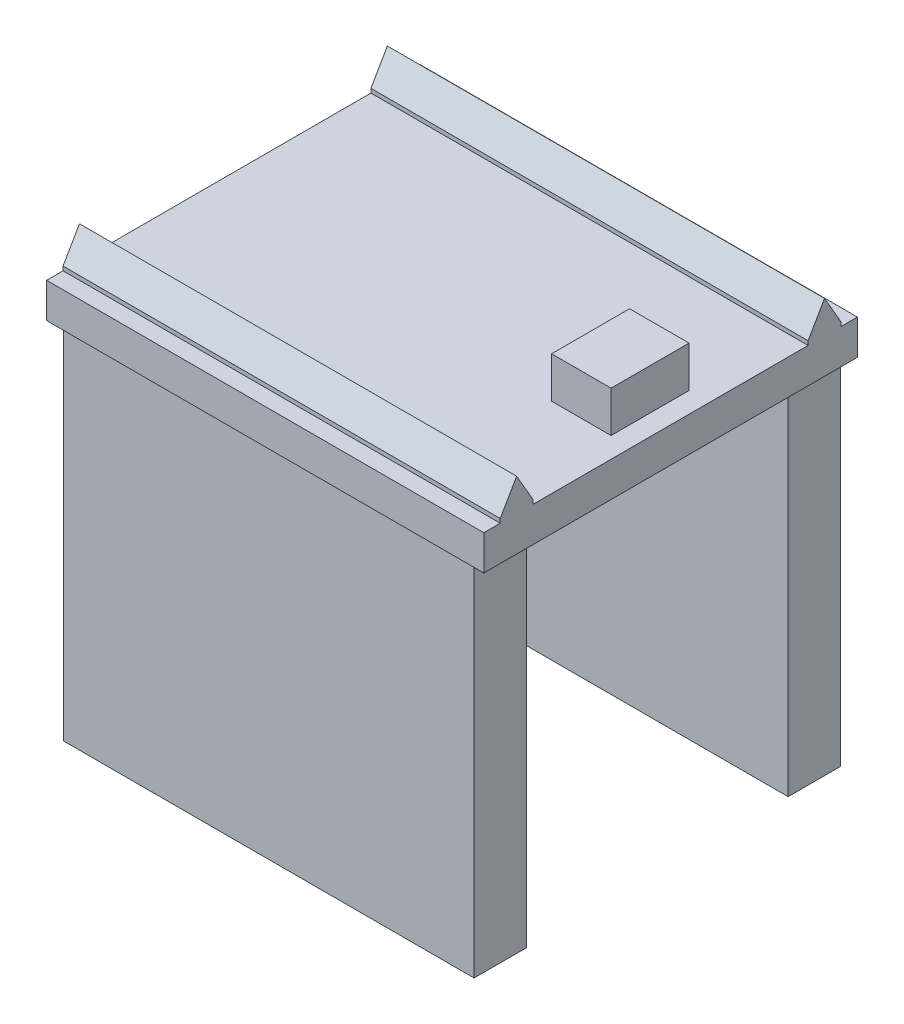
ISO-10303-21;
HEADER;
FILE_DESCRIPTION(('STEP AP214'),'2;1');
FILE_NAME('part.step','',(''),(''),'','','');
FILE_SCHEMA(('AUTOMOTIVE_DESIGN { 1 0 10303 214 1 1 1 1 }'));
ENDSEC;
DATA;
#1=APPLICATION_CONTEXT('core data for automotive mechanical design processes');
#2=APPLICATION_PROTOCOL_DEFINITION('international standard','automotive_design',2000,#1);
#3=PRODUCT_CONTEXT('',#1,'mechanical');
#4=PRODUCT('Part','Part','',(#3));
#5=PRODUCT_RELATED_PRODUCT_CATEGORY('part','',(#4));
#6=PRODUCT_DEFINITION_FORMATION('','',#4);
#7=PRODUCT_DEFINITION_CONTEXT('part definition',#1,'design');
#8=PRODUCT_DEFINITION('design','',#6,#7);
#9=PRODUCT_DEFINITION_SHAPE('','',#8);
#10=(LENGTH_UNIT() NAMED_UNIT(*) SI_UNIT(.MILLI.,.METRE.));
#11=(NAMED_UNIT(*) PLANE_ANGLE_UNIT() SI_UNIT($,.RADIAN.));
#12=(NAMED_UNIT(*) SI_UNIT($,.STERADIAN.) SOLID_ANGLE_UNIT());
#13=UNCERTAINTY_MEASURE_WITH_UNIT(LENGTH_MEASURE(1.E-05),#10,'distance_accuracy_value','');
#14=(GEOMETRIC_REPRESENTATION_CONTEXT(3) GLOBAL_UNCERTAINTY_ASSIGNED_CONTEXT((#13)) GLOBAL_UNIT_ASSIGNED_CONTEXT((#10,
#11,#12)) REPRESENTATION_CONTEXT('',''));
#15=CARTESIAN_POINT('',(0.,0.,0.));
#16=DIRECTION('',(0.,0.,1.));
#17=DIRECTION('',(1.,0.,0.));
#18=AXIS2_PLACEMENT_3D('',#15,#16,#17);
#19=CARTESIAN_POINT('',(0.,0.,0.));
#20=DIRECTION('',(0.,1.,0.));
#21=DIRECTION('',(0.,0.,1.));
#22=AXIS2_PLACEMENT_3D('',#19,#20,#21);
#23=PLANE('',#22);
#24=DIRECTION('',(0.,0.,1.));
#25=VECTOR('',#24,1.);
#26=CARTESIAN_POINT('',(10.,0.,8.925));
#27=LINE('',#26,#25);
#28=CARTESIAN_POINT('',(9.99999999999999,0.,6.375));
#29=VERTEX_POINT('',#28);
#30=CARTESIAN_POINT('',(10.,0.,8.925));
#31=VERTEX_POINT('',#30);
#32=EDGE_CURVE('E224',#29,#31,#27,.T.);
#33=ORIENTED_EDGE('',*,*,#32,.F.);
#34=DIRECTION('',(1.,0.,0.));
#35=VECTOR('',#34,1.);
#36=CARTESIAN_POINT('',(-10.,0.,6.375));
#37=LINE('',#36,#35);
#38=CARTESIAN_POINT('',(-10.,0.,6.375));
#39=VERTEX_POINT('',#38);
#40=EDGE_CURVE('E257',#39,#29,#37,.T.);
#41=ORIENTED_EDGE('',*,*,#40,.F.);
#42=DIRECTION('',(0.,0.,-1.));
#43=VECTOR('',#42,1.);
#44=CARTESIAN_POINT('',(-10.,0.,8.925));
#45=LINE('',#44,#43);
#46=CARTESIAN_POINT('',(-10.,0.,8.925));
#47=VERTEX_POINT('',#46);
#48=EDGE_CURVE('E269',#47,#39,#45,.T.);
#49=ORIENTED_EDGE('',*,*,#48,.F.);
#50=DIRECTION('',(-1.,0.,0.));
#51=VECTOR('',#50,1.);
#52=CARTESIAN_POINT('',(-10.,0.,8.925));
#53=LINE('',#52,#51);
#54=EDGE_CURVE('E266',#31,#47,#53,.T.);
#55=ORIENTED_EDGE('',*,*,#54,.F.);
#56=EDGE_LOOP('',(#33,#41,#49,#55));
#57=FACE_BOUND('',#56,.T.);
#58=DIRECTION('',(0.,0.,-1.));
#59=VECTOR('',#58,1.);
#60=CARTESIAN_POINT('',(10.65,0.,-9.1));
#61=LINE('',#60,#59);
#62=CARTESIAN_POINT('',(10.65,0.,9.1));
#63=VERTEX_POINT('',#62);
#64=CARTESIAN_POINT('',(10.65,0.,-9.1));
#65=VERTEX_POINT('',#64);
#66=EDGE_CURVE('E343',#63,#65,#61,.T.);
#67=ORIENTED_EDGE('',*,*,#66,.F.);
#68=DIRECTION('',(1.,0.,0.));
#69=VECTOR('',#68,1.);
#70=CARTESIAN_POINT('',(-10.65,0.,9.1));
#71=LINE('',#70,#69);
#72=CARTESIAN_POINT('',(-10.65,0.,9.1));
#73=VERTEX_POINT('',#72);
#74=EDGE_CURVE('E365',#73,#63,#71,.T.);
#75=ORIENTED_EDGE('',*,*,#74,.F.);
#76=DIRECTION('',(0.,0.,1.));
#77=VECTOR('',#76,1.);
#78=CARTESIAN_POINT('',(-10.65,0.,-9.1));
#79=LINE('',#78,#77);
#80=CARTESIAN_POINT('',(-10.65,0.,-9.1));
#81=VERTEX_POINT('',#80);
#82=EDGE_CURVE('E363',#81,#73,#79,.T.);
#83=ORIENTED_EDGE('',*,*,#82,.F.);
#84=DIRECTION('',(-1.,0.,0.));
#85=VECTOR('',#84,1.);
#86=CARTESIAN_POINT('',(-10.65,0.,-9.1));
#87=LINE('',#86,#85);
#88=EDGE_CURVE('E361',#65,#81,#87,.T.);
#89=ORIENTED_EDGE('',*,*,#88,.F.);
#90=EDGE_LOOP('',(#67,#75,#83,#89));
#91=FACE_BOUND('',#90,.T.);
#92=DIRECTION('',(0.,0.,-1.));
#93=VECTOR('',#92,1.);
#94=CARTESIAN_POINT('',(-10.,0.,-8.925));
#95=LINE('',#94,#93);
#96=CARTESIAN_POINT('',(-10.,0.,-6.375));
#97=VERTEX_POINT('',#96);
#98=CARTESIAN_POINT('',(-10.,0.,-8.925));
#99=VERTEX_POINT('',#98);
#100=EDGE_CURVE('E218',#97,#99,#95,.T.);
#101=ORIENTED_EDGE('',*,*,#100,.F.);
#102=DIRECTION('',(-1.,0.,0.));
#103=VECTOR('',#102,1.);
#104=CARTESIAN_POINT('',(-10.,0.,-6.375));
#105=LINE('',#104,#103);
#106=CARTESIAN_POINT('',(9.99999999999999,0.,-6.375));
#107=VERTEX_POINT('',#106);
#108=EDGE_CURVE('E220',#107,#97,#105,.T.);
#109=ORIENTED_EDGE('',*,*,#108,.F.);
#110=DIRECTION('',(0.,0.,1.));
#111=VECTOR('',#110,1.);
#112=CARTESIAN_POINT('',(10.,0.,-8.925));
#113=LINE('',#112,#111);
#114=CARTESIAN_POINT('',(10.,0.,-8.925));
#115=VERTEX_POINT('',#114);
#116=EDGE_CURVE('E70',#115,#107,#113,.T.);
#117=ORIENTED_EDGE('',*,*,#116,.F.);
#118=DIRECTION('',(1.,0.,0.));
#119=VECTOR('',#118,1.);
#120=CARTESIAN_POINT('',(-10.,0.,-8.925));
#121=LINE('',#120,#119);
#122=EDGE_CURVE('E65',#99,#115,#121,.T.);
#123=ORIENTED_EDGE('',*,*,#122,.F.);
#124=EDGE_LOOP('',(#101,#109,#117,#123));
#125=FACE_BOUND('',#124,.T.);
#126=ADVANCED_FACE('F47',(#57,#91,#125),#23,.F.);
#127=CARTESIAN_POINT('',(0.,1.7,0.));
#128=DIRECTION('',(0.,1.,0.));
#129=DIRECTION('',(0.,0.,1.));
#130=AXIS2_PLACEMENT_3D('',#127,#128,#129);
#131=PLANE('',#130);
#132=DIRECTION('',(0.,0.,1.));
#133=VECTOR('',#132,1.);
#134=CARTESIAN_POINT('',(-10.65,1.7,-9.1));
#135=LINE('',#134,#133);
#136=CARTESIAN_POINT('',(-10.65,1.7,-6.7));
#137=VERTEX_POINT('',#136);
#138=CARTESIAN_POINT('',(-10.65,1.7,6.7));
#139=VERTEX_POINT('',#138);
#140=EDGE_CURVE('E356',#137,#139,#135,.T.);
#141=ORIENTED_EDGE('',*,*,#140,.T.);
#142=DIRECTION('',(-1.,0.,0.));
#143=VECTOR('',#142,1.);
#144=CARTESIAN_POINT('',(-10.65,1.7,6.7));
#145=LINE('',#144,#143);
#146=CARTESIAN_POINT('',(10.65,1.7,6.7));
#147=VERTEX_POINT('',#146);
#148=EDGE_CURVE('E323',#147,#139,#145,.T.);
#149=ORIENTED_EDGE('',*,*,#148,.F.);
#150=DIRECTION('',(0.,0.,-1.));
#151=VECTOR('',#150,1.);
#152=CARTESIAN_POINT('',(10.65,1.7,-9.1));
#153=LINE('',#152,#151);
#154=CARTESIAN_POINT('',(10.65,1.7,-6.7));
#155=VERTEX_POINT('',#154);
#156=EDGE_CURVE('E348',#147,#155,#153,.T.);
#157=ORIENTED_EDGE('',*,*,#156,.T.);
#158=DIRECTION('',(1.,0.,0.));
#159=VECTOR('',#158,1.);
#160=CARTESIAN_POINT('',(-10.65,1.7,-6.7));
#161=LINE('',#160,#159);
#162=EDGE_CURVE('E329',#137,#155,#161,.T.);
#163=ORIENTED_EDGE('',*,*,#162,.F.);
#164=EDGE_LOOP('',(#141,#149,#157,#163));
#165=FACE_BOUND('',#164,.T.);
#166=DIRECTION('',(-1.,0.,0.));
#167=VECTOR('',#166,1.);
#168=CARTESIAN_POINT('',(6.75,1.7,-1.9));
#169=LINE('',#168,#167);
#170=CARTESIAN_POINT('',(9.65,1.7,-1.9));
#171=VERTEX_POINT('',#170);
#172=CARTESIAN_POINT('',(6.75,1.7,-1.9));
#173=VERTEX_POINT('',#172);
#174=EDGE_CURVE('E299',#171,#173,#169,.T.);
#175=ORIENTED_EDGE('',*,*,#174,.F.);
#176=DIRECTION('',(0.,0.,-1.));
#177=VECTOR('',#176,1.);
#178=CARTESIAN_POINT('',(9.65,1.7,-1.9));
#179=LINE('',#178,#177);
#180=CARTESIAN_POINT('',(9.65,1.7,1.9));
#181=VERTEX_POINT('',#180);
#182=EDGE_CURVE('E285',#181,#171,#179,.T.);
#183=ORIENTED_EDGE('',*,*,#182,.F.);
#184=DIRECTION('',(1.,0.,0.));
#185=VECTOR('',#184,1.);
#186=CARTESIAN_POINT('',(6.75,1.7,1.9));
#187=LINE('',#186,#185);
#188=CARTESIAN_POINT('',(6.75,1.7,1.9));
#189=VERTEX_POINT('',#188);
#190=EDGE_CURVE('E290',#189,#181,#187,.T.);
#191=ORIENTED_EDGE('',*,*,#190,.F.);
#192=DIRECTION('',(0.,0.,1.));
#193=VECTOR('',#192,1.);
#194=CARTESIAN_POINT('',(6.75,1.7,-1.9));
#195=LINE('',#194,#193);
#196=EDGE_CURVE('E301',#173,#189,#195,.T.);
#197=ORIENTED_EDGE('',*,*,#196,.F.);
#198=EDGE_LOOP('',(#175,#183,#191,#197));
#199=FACE_BOUND('',#198,.T.);
#200=ADVANCED_FACE('F437',(#165,#199),#131,.T.);
#201=CARTESIAN_POINT('',(10.65,1.7,9.1));
#202=VERTEX_POINT('',#201);
#203=CARTESIAN_POINT('',(10.65,1.7,8.3));
#204=VERTEX_POINT('',#203);
#205=EDGE_CURVE('E344',#202,#204,#153,.T.);
#206=ORIENTED_EDGE('',*,*,#205,.T.);
#207=DIRECTION('',(1.,0.,0.));
#208=VECTOR('',#207,1.);
#209=CARTESIAN_POINT('',(-10.65,1.7,8.3));
#210=LINE('',#209,#208);
#211=CARTESIAN_POINT('',(-10.65,1.7,8.3));
#212=VERTEX_POINT('',#211);
#213=EDGE_CURVE('E326',#212,#204,#210,.T.);
#214=ORIENTED_EDGE('',*,*,#213,.F.);
#215=CARTESIAN_POINT('',(-10.65,1.7,9.1));
#216=VERTEX_POINT('',#215);
#217=EDGE_CURVE('E351',#212,#216,#135,.T.);
#218=ORIENTED_EDGE('',*,*,#217,.T.);
#219=DIRECTION('',(1.,0.,0.));
#220=VECTOR('',#219,1.);
#221=CARTESIAN_POINT('',(-10.65,1.7,9.1));
#222=LINE('',#221,#220);
#223=EDGE_CURVE('E355',#216,#202,#222,.T.);
#224=ORIENTED_EDGE('',*,*,#223,.T.);
#225=EDGE_LOOP('',(#206,#214,#218,#224));
#226=FACE_BOUND('',#225,.T.);
#227=ADVANCED_FACE('F449',(#226),#131,.T.);
#228=DIRECTION('',(-1.,0.,0.));
#229=VECTOR('',#228,1.);
#230=CARTESIAN_POINT('',(-10.65,1.7,-8.3));
#231=LINE('',#230,#229);
#232=CARTESIAN_POINT('',(10.65,1.7,-8.3));
#233=VERTEX_POINT('',#232);
#234=CARTESIAN_POINT('',(-10.65,1.7,-8.3));
#235=VERTEX_POINT('',#234);
#236=EDGE_CURVE('E332',#233,#235,#231,.T.);
#237=ORIENTED_EDGE('',*,*,#236,.F.);
#238=CARTESIAN_POINT('',(10.65,1.7,-9.1));
#239=VERTEX_POINT('',#238);
#240=EDGE_CURVE('E349',#233,#239,#153,.T.);
#241=ORIENTED_EDGE('',*,*,#240,.T.);
#242=DIRECTION('',(-1.,0.,0.));
#243=VECTOR('',#242,1.);
#244=CARTESIAN_POINT('',(-10.65,1.7,-9.1));
#245=LINE('',#244,#243);
#246=CARTESIAN_POINT('',(-10.65,1.7,-9.1));
#247=VERTEX_POINT('',#246);
#248=EDGE_CURVE('E347',#239,#247,#245,.T.);
#249=ORIENTED_EDGE('',*,*,#248,.T.);
#250=EDGE_CURVE('E352',#247,#235,#135,.T.);
#251=ORIENTED_EDGE('',*,*,#250,.T.);
#252=EDGE_LOOP('',(#237,#241,#249,#251));
#253=FACE_BOUND('',#252,.T.);
#254=ADVANCED_FACE('F426',(#253),#131,.T.);
#255=CARTESIAN_POINT('',(10.65,1.7,-9.1));
#256=DIRECTION('',(-1.,0.,0.));
#257=DIRECTION('',(0.,0.,1.));
#258=AXIS2_PLACEMENT_3D('',#255,#256,#257);
#259=PLANE('',#258);
#260=DIRECTION('',(0.,-0.86602540378444,-0.499999999999998));
#261=VECTOR('',#260,1.);
#262=CARTESIAN_POINT('',(10.65,3.3,7.50829037686548));
#263=LINE('',#262,#261);
#264=CARTESIAN_POINT('',(10.65,1.89999999999999,6.7));
#265=VERTEX_POINT('',#264);
#266=CARTESIAN_POINT('',(10.65,3.28564064605509,7.5));
#267=VERTEX_POINT('',#266);
#268=EDGE_CURVE('E382',#265,#267,#263,.F.);
#269=ORIENTED_EDGE('',*,*,#268,.T.);
#270=DIRECTION('',(0.,0.86602540378444,-0.499999999999998));
#271=VECTOR('',#270,1.);
#272=CARTESIAN_POINT('',(10.65,3.3,7.49170962313452));
#273=LINE('',#272,#271);
#274=CARTESIAN_POINT('',(10.65,1.89999999999999,8.3));
#275=VERTEX_POINT('',#274);
#276=EDGE_CURVE('E384',#267,#275,#273,.F.);
#277=ORIENTED_EDGE('',*,*,#276,.T.);
#278=DIRECTION('',(0.,-1.,0.));
#279=VECTOR('',#278,1.);
#280=CARTESIAN_POINT('',(10.65,3.3,8.3));
#281=LINE('',#280,#279);
#282=EDGE_CURVE('E316',#275,#204,#281,.T.);
#283=ORIENTED_EDGE('',*,*,#282,.T.);
#284=ORIENTED_EDGE('',*,*,#205,.F.);
#285=DIRECTION('',(0.,-1.,0.));
#286=VECTOR('',#285,1.);
#287=CARTESIAN_POINT('',(10.65,1.7,9.1));
#288=LINE('',#287,#286);
#289=EDGE_CURVE('E358',#202,#63,#288,.T.);
#290=ORIENTED_EDGE('',*,*,#289,.T.);
#291=ORIENTED_EDGE('',*,*,#66,.T.);
#292=DIRECTION('',(0.,-1.,0.));
#293=VECTOR('',#292,1.);
#294=CARTESIAN_POINT('',(10.65,1.7,-9.1));
#295=LINE('',#294,#293);
#296=EDGE_CURVE('E375',#239,#65,#295,.T.);
#297=ORIENTED_EDGE('',*,*,#296,.F.);
#298=ORIENTED_EDGE('',*,*,#240,.F.);
#299=DIRECTION('',(0.,-1.,0.));
#300=VECTOR('',#299,1.);
#301=CARTESIAN_POINT('',(10.65,3.3,-8.3));
#302=LINE('',#301,#300);
#303=CARTESIAN_POINT('',(10.65,1.89999999999999,-8.3));
#304=VERTEX_POINT('',#303);
#305=EDGE_CURVE('E337',#304,#233,#302,.T.);
#306=ORIENTED_EDGE('',*,*,#305,.F.);
#307=DIRECTION('',(0.,0.86602540378444,0.499999999999998));
#308=VECTOR('',#307,1.);
#309=CARTESIAN_POINT('',(10.65,3.3,-7.49170962313452));
#310=LINE('',#309,#308);
#311=CARTESIAN_POINT('',(10.65,3.28564064605509,-7.5));
#312=VERTEX_POINT('',#311);
#313=EDGE_CURVE('E378',#304,#312,#310,.T.);
#314=ORIENTED_EDGE('',*,*,#313,.T.);
#315=DIRECTION('',(0.,-0.86602540378444,0.499999999999998));
#316=VECTOR('',#315,1.);
#317=CARTESIAN_POINT('',(10.65,3.3,-7.50829037686548));
#318=LINE('',#317,#316);
#319=CARTESIAN_POINT('',(10.65,1.89999999999999,-6.7));
#320=VERTEX_POINT('',#319);
#321=EDGE_CURVE('E380',#312,#320,#318,.T.);
#322=ORIENTED_EDGE('',*,*,#321,.T.);
#323=DIRECTION('',(0.,-1.,0.));
#324=VECTOR('',#323,1.);
#325=CARTESIAN_POINT('',(10.65,3.3,-6.7));
#326=LINE('',#325,#324);
#327=EDGE_CURVE('E339',#320,#155,#326,.T.);
#328=ORIENTED_EDGE('',*,*,#327,.T.);
#329=ORIENTED_EDGE('',*,*,#156,.F.);
#330=DIRECTION('',(0.,-1.,0.));
#331=VECTOR('',#330,1.);
#332=CARTESIAN_POINT('',(10.65,3.3,6.7));
#333=LINE('',#332,#331);
#334=EDGE_CURVE('E319',#265,#147,#333,.T.);
#335=ORIENTED_EDGE('',*,*,#334,.F.);
#336=EDGE_LOOP('',(#269,#277,#283,#284,#290,#291,#297,#298,#306,#314,#322,#328,#329,#335));
#337=FACE_BOUND('',#336,.T.);
#338=ADVANCED_FACE('F430',(#337),#259,.F.);
#339=CARTESIAN_POINT('',(-10.65,1.7,-9.1));
#340=DIRECTION('',(0.,0.,1.));
#341=DIRECTION('',(1.,0.,0.));
#342=AXIS2_PLACEMENT_3D('',#339,#340,#341);
#343=PLANE('',#342);
#344=ORIENTED_EDGE('',*,*,#88,.T.);
#345=DIRECTION('',(0.,-1.,0.));
#346=VECTOR('',#345,1.);
#347=CARTESIAN_POINT('',(-10.65,1.7,-9.1));
#348=LINE('',#347,#346);
#349=EDGE_CURVE('E372',#247,#81,#348,.T.);
#350=ORIENTED_EDGE('',*,*,#349,.F.);
#351=ORIENTED_EDGE('',*,*,#248,.F.);
#352=ORIENTED_EDGE('',*,*,#296,.T.);
#353=EDGE_LOOP('',(#344,#350,#351,#352));
#354=FACE_BOUND('',#353,.T.);
#355=ADVANCED_FACE('F493',(#354),#343,.F.);
#356=CARTESIAN_POINT('',(-10.65,1.7,-9.1));
#357=DIRECTION('',(1.,0.,0.));
#358=DIRECTION('',(0.,0.,-1.));
#359=AXIS2_PLACEMENT_3D('',#356,#357,#358);
#360=PLANE('',#359);
#361=DIRECTION('',(0.,-1.,0.));
#362=VECTOR('',#361,1.);
#363=CARTESIAN_POINT('',(-10.65,3.3,8.3));
#364=LINE('',#363,#362);
#365=CARTESIAN_POINT('',(-10.65,1.89999999999999,8.3));
#366=VERTEX_POINT('',#365);
#367=EDGE_CURVE('E314',#366,#212,#364,.T.);
#368=ORIENTED_EDGE('',*,*,#367,.F.);
#369=DIRECTION('',(0.,-0.86602540378444,0.499999999999998));
#370=VECTOR('',#369,1.);
#371=CARTESIAN_POINT('',(-10.65,3.3,7.49170962313452));
#372=LINE('',#371,#370);
#373=CARTESIAN_POINT('',(-10.65,3.2856406460551,7.5));
#374=VERTEX_POINT('',#373);
#375=EDGE_CURVE('E395',#366,#374,#372,.F.);
#376=ORIENTED_EDGE('',*,*,#375,.T.);
#377=DIRECTION('',(0.,0.86602540378444,0.499999999999998));
#378=VECTOR('',#377,1.);
#379=CARTESIAN_POINT('',(-10.65,3.3,7.50829037686548));
#380=LINE('',#379,#378);
#381=CARTESIAN_POINT('',(-10.65,1.89999999999999,6.7));
#382=VERTEX_POINT('',#381);
#383=EDGE_CURVE('E393',#374,#382,#380,.F.);
#384=ORIENTED_EDGE('',*,*,#383,.T.);
#385=DIRECTION('',(0.,-1.,0.));
#386=VECTOR('',#385,1.);
#387=CARTESIAN_POINT('',(-10.65,3.3,6.7));
#388=LINE('',#387,#386);
#389=EDGE_CURVE('E321',#382,#139,#388,.T.);
#390=ORIENTED_EDGE('',*,*,#389,.T.);
#391=ORIENTED_EDGE('',*,*,#140,.F.);
#392=DIRECTION('',(0.,-1.,0.));
#393=VECTOR('',#392,1.);
#394=CARTESIAN_POINT('',(-10.65,3.3,-6.7));
#395=LINE('',#394,#393);
#396=CARTESIAN_POINT('',(-10.65,1.89999999999999,-6.7));
#397=VERTEX_POINT('',#396);
#398=EDGE_CURVE('E341',#397,#137,#395,.T.);
#399=ORIENTED_EDGE('',*,*,#398,.F.);
#400=DIRECTION('',(0.,0.86602540378444,-0.499999999999998));
#401=VECTOR('',#400,1.);
#402=CARTESIAN_POINT('',(-10.65,3.3,-7.50829037686548));
#403=LINE('',#402,#401);
#404=CARTESIAN_POINT('',(-10.65,3.2856406460551,-7.5));
#405=VERTEX_POINT('',#404);
#406=EDGE_CURVE('E391',#397,#405,#403,.T.);
#407=ORIENTED_EDGE('',*,*,#406,.T.);
#408=DIRECTION('',(0.,-0.86602540378444,-0.499999999999998));
#409=VECTOR('',#408,1.);
#410=CARTESIAN_POINT('',(-10.65,3.3,-7.49170962313452));
#411=LINE('',#410,#409);
#412=CARTESIAN_POINT('',(-10.65,1.89999999999999,-8.3));
#413=VERTEX_POINT('',#412);
#414=EDGE_CURVE('E389',#405,#413,#411,.T.);
#415=ORIENTED_EDGE('',*,*,#414,.T.);
#416=DIRECTION('',(0.,-1.,0.));
#417=VECTOR('',#416,1.);
#418=CARTESIAN_POINT('',(-10.65,3.3,-8.3));
#419=LINE('',#418,#417);
#420=EDGE_CURVE('E335',#413,#235,#419,.T.);
#421=ORIENTED_EDGE('',*,*,#420,.T.);
#422=ORIENTED_EDGE('',*,*,#250,.F.);
#423=ORIENTED_EDGE('',*,*,#349,.T.);
#424=ORIENTED_EDGE('',*,*,#82,.T.);
#425=DIRECTION('',(0.,-1.,0.));
#426=VECTOR('',#425,1.);
#427=CARTESIAN_POINT('',(-10.65,1.7,9.1));
#428=LINE('',#427,#426);
#429=EDGE_CURVE('E369',#216,#73,#428,.T.);
#430=ORIENTED_EDGE('',*,*,#429,.F.);
#431=ORIENTED_EDGE('',*,*,#217,.F.);
#432=EDGE_LOOP('',(#368,#376,#384,#390,#391,#399,#407,#415,#421,#422,#423,#424,#430,#431));
#433=FACE_BOUND('',#432,.T.);
#434=ADVANCED_FACE('F417',(#433),#360,.F.);
#435=CARTESIAN_POINT('',(-10.65,1.7,9.1));
#436=DIRECTION('',(0.,0.,-1.));
#437=DIRECTION('',(-1.,0.,0.));
#438=AXIS2_PLACEMENT_3D('',#435,#436,#437);
#439=PLANE('',#438);
#440=ORIENTED_EDGE('',*,*,#74,.T.);
#441=ORIENTED_EDGE('',*,*,#289,.F.);
#442=ORIENTED_EDGE('',*,*,#223,.F.);
#443=ORIENTED_EDGE('',*,*,#429,.T.);
#444=EDGE_LOOP('',(#440,#441,#442,#443));
#445=FACE_BOUND('',#444,.T.);
#446=ADVANCED_FACE('F455',(#445),#439,.F.);
#447=CARTESIAN_POINT('',(-10.65,3.3,-6.7));
#448=DIRECTION('',(0.,0.,-1.));
#449=DIRECTION('',(-1.,0.,0.));
#450=AXIS2_PLACEMENT_3D('',#447,#448,#449);
#451=PLANE('',#450);
#452=ORIENTED_EDGE('',*,*,#327,.F.);
#453=DIRECTION('',(-1.,0.,0.));
#454=VECTOR('',#453,1.);
#455=CARTESIAN_POINT('',(-10.65,1.89999999999999,-6.7));
#456=LINE('',#455,#454);
#457=EDGE_CURVE('E57',#320,#397,#456,.T.);
#458=ORIENTED_EDGE('',*,*,#457,.T.);
#459=ORIENTED_EDGE('',*,*,#398,.T.);
#460=ORIENTED_EDGE('',*,*,#162,.T.);
#461=EDGE_LOOP('',(#452,#458,#459,#460));
#462=FACE_BOUND('',#461,.T.);
#463=ADVANCED_FACE('F443',(#462),#451,.F.);
#464=CARTESIAN_POINT('',(-10.65,3.3,-8.3));
#465=DIRECTION('',(0.,0.,1.));
#466=DIRECTION('',(1.,0.,0.));
#467=AXIS2_PLACEMENT_3D('',#464,#465,#466);
#468=PLANE('',#467);
#469=ORIENTED_EDGE('',*,*,#420,.F.);
#470=DIRECTION('',(1.,0.,0.));
#471=VECTOR('',#470,1.);
#472=CARTESIAN_POINT('',(10.65,1.89999999999999,-8.3));
#473=LINE('',#472,#471);
#474=EDGE_CURVE('E11',#413,#304,#473,.T.);
#475=ORIENTED_EDGE('',*,*,#474,.T.);
#476=ORIENTED_EDGE('',*,*,#305,.T.);
#477=ORIENTED_EDGE('',*,*,#236,.T.);
#478=EDGE_LOOP('',(#469,#475,#476,#477));
#479=FACE_BOUND('',#478,.T.);
#480=ADVANCED_FACE('F421',(#479),#468,.F.);
#481=CARTESIAN_POINT('',(-10.65,3.3,8.3));
#482=DIRECTION('',(0.,0.,-1.));
#483=DIRECTION('',(-1.,0.,0.));
#484=AXIS2_PLACEMENT_3D('',#481,#482,#483);
#485=PLANE('',#484);
#486=ORIENTED_EDGE('',*,*,#282,.F.);
#487=DIRECTION('',(-1.,0.,0.));
#488=VECTOR('',#487,1.);
#489=CARTESIAN_POINT('',(-10.65,1.89999999999999,8.3));
#490=LINE('',#489,#488);
#491=EDGE_CURVE('E386',#275,#366,#490,.T.);
#492=ORIENTED_EDGE('',*,*,#491,.T.);
#493=ORIENTED_EDGE('',*,*,#367,.T.);
#494=ORIENTED_EDGE('',*,*,#213,.T.);
#495=EDGE_LOOP('',(#486,#492,#493,#494));
#496=FACE_BOUND('',#495,.T.);
#497=ADVANCED_FACE('F461',(#496),#485,.F.);
#498=CARTESIAN_POINT('',(-10.65,3.3,6.7));
#499=DIRECTION('',(0.,0.,1.));
#500=DIRECTION('',(1.,0.,0.));
#501=AXIS2_PLACEMENT_3D('',#498,#499,#500);
#502=PLANE('',#501);
#503=ORIENTED_EDGE('',*,*,#389,.F.);
#504=DIRECTION('',(1.,0.,0.));
#505=VECTOR('',#504,1.);
#506=CARTESIAN_POINT('',(-10.65,1.89999999999999,6.7));
#507=LINE('',#506,#505);
#508=EDGE_CURVE('E397',#382,#265,#507,.T.);
#509=ORIENTED_EDGE('',*,*,#508,.T.);
#510=ORIENTED_EDGE('',*,*,#334,.T.);
#511=ORIENTED_EDGE('',*,*,#148,.T.);
#512=EDGE_LOOP('',(#503,#509,#510,#511));
#513=FACE_BOUND('',#512,.T.);
#514=ADVANCED_FACE('F468',(#513),#502,.F.);
#515=CARTESIAN_POINT('',(0.,3.3,7.50829037686548));
#516=DIRECTION('',(0.,-0.499999999999998,0.86602540378444));
#517=DIRECTION('',(-1.,0.,0.));
#518=AXIS2_PLACEMENT_3D('',#515,#516,#517);
#519=PLANE('',#518);
#520=ORIENTED_EDGE('',*,*,#508,.F.);
#521=ORIENTED_EDGE('',*,*,#383,.F.);
#522=DIRECTION('',(-1.,0.,0.));
#523=VECTOR('',#522,1.);
#524=CARTESIAN_POINT('',(0.,3.2856406460551,7.5));
#525=LINE('',#524,#523);
#526=EDGE_CURVE('E317',#267,#374,#525,.T.);
#527=ORIENTED_EDGE('',*,*,#526,.F.);
#528=ORIENTED_EDGE('',*,*,#268,.F.);
#529=EDGE_LOOP('',(#520,#521,#527,#528));
#530=FACE_BOUND('',#529,.T.);
#531=ADVANCED_FACE('F465',(#530),#519,.F.);
#532=CARTESIAN_POINT('',(0.,3.3,7.49170962313452));
#533=DIRECTION('',(0.,-0.499999999999998,-0.86602540378444));
#534=DIRECTION('',(1.,0.,0.));
#535=AXIS2_PLACEMENT_3D('',#532,#533,#534);
#536=PLANE('',#535);
#537=ORIENTED_EDGE('',*,*,#375,.F.);
#538=ORIENTED_EDGE('',*,*,#491,.F.);
#539=ORIENTED_EDGE('',*,*,#276,.F.);
#540=ORIENTED_EDGE('',*,*,#526,.T.);
#541=EDGE_LOOP('',(#537,#538,#539,#540));
#542=FACE_BOUND('',#541,.T.);
#543=ADVANCED_FACE('F475',(#542),#536,.F.);
#544=CARTESIAN_POINT('',(0.,3.3,-7.49170962313452));
#545=DIRECTION('',(0.,0.499999999999998,-0.86602540378444));
#546=DIRECTION('',(1.,0.,0.));
#547=AXIS2_PLACEMENT_3D('',#544,#545,#546);
#548=PLANE('',#547);
#549=ORIENTED_EDGE('',*,*,#474,.F.);
#550=ORIENTED_EDGE('',*,*,#414,.F.);
#551=DIRECTION('',(-1.,0.,0.));
#552=VECTOR('',#551,1.);
#553=CARTESIAN_POINT('',(0.,3.2856406460551,-7.5));
#554=LINE('',#553,#552);
#555=EDGE_CURVE('E52',#312,#405,#554,.T.);
#556=ORIENTED_EDGE('',*,*,#555,.F.);
#557=ORIENTED_EDGE('',*,*,#313,.F.);
#558=EDGE_LOOP('',(#549,#550,#556,#557));
#559=FACE_BOUND('',#558,.T.);
#560=ADVANCED_FACE('F50',(#559),#548,.T.);
#561=CARTESIAN_POINT('',(0.,3.3,-7.50829037686548));
#562=DIRECTION('',(0.,0.499999999999998,0.86602540378444));
#563=DIRECTION('',(-1.,0.,0.));
#564=AXIS2_PLACEMENT_3D('',#561,#562,#563);
#565=PLANE('',#564);
#566=ORIENTED_EDGE('',*,*,#406,.F.);
#567=ORIENTED_EDGE('',*,*,#457,.F.);
#568=ORIENTED_EDGE('',*,*,#321,.F.);
#569=ORIENTED_EDGE('',*,*,#555,.T.);
#570=EDGE_LOOP('',(#566,#567,#568,#569));
#571=FACE_BOUND('',#570,.T.);
#572=ADVANCED_FACE('F408',(#571),#565,.T.);
#573=CARTESIAN_POINT('',(9.65,3.7,-1.9));
#574=DIRECTION('',(-1.,0.,0.));
#575=DIRECTION('',(0.,0.,1.));
#576=AXIS2_PLACEMENT_3D('',#573,#574,#575);
#577=PLANE('',#576);
#578=ORIENTED_EDGE('',*,*,#182,.T.);
#579=DIRECTION('',(0.,-1.,0.));
#580=VECTOR('',#579,1.);
#581=CARTESIAN_POINT('',(9.65,3.7,-1.9));
#582=LINE('',#581,#580);
#583=CARTESIAN_POINT('',(9.65,3.7,-1.9));
#584=VERTEX_POINT('',#583);
#585=EDGE_CURVE('E312',#584,#171,#582,.T.);
#586=ORIENTED_EDGE('',*,*,#585,.F.);
#587=DIRECTION('',(0.,0.,-1.));
#588=VECTOR('',#587,1.);
#589=CARTESIAN_POINT('',(9.65,3.7,-1.9));
#590=LINE('',#589,#588);
#591=CARTESIAN_POINT('',(9.65,3.7,1.9));
#592=VERTEX_POINT('',#591);
#593=EDGE_CURVE('E286',#592,#584,#590,.T.);
#594=ORIENTED_EDGE('',*,*,#593,.F.);
#595=DIRECTION('',(0.,-1.,0.));
#596=VECTOR('',#595,1.);
#597=CARTESIAN_POINT('',(9.65,3.7,1.9));
#598=LINE('',#597,#596);
#599=EDGE_CURVE('E296',#592,#181,#598,.T.);
#600=ORIENTED_EDGE('',*,*,#599,.T.);
#601=EDGE_LOOP('',(#578,#586,#594,#600));
#602=FACE_BOUND('',#601,.T.);
#603=ADVANCED_FACE('F510',(#602),#577,.F.);
#604=CARTESIAN_POINT('',(6.75,3.7,-1.9));
#605=DIRECTION('',(0.,0.,1.));
#606=DIRECTION('',(1.,0.,0.));
#607=AXIS2_PLACEMENT_3D('',#604,#605,#606);
#608=PLANE('',#607);
#609=ORIENTED_EDGE('',*,*,#174,.T.);
#610=DIRECTION('',(0.,-1.,0.));
#611=VECTOR('',#610,1.);
#612=CARTESIAN_POINT('',(6.75,3.7,-1.9));
#613=LINE('',#612,#611);
#614=CARTESIAN_POINT('',(6.75,3.7,-1.9));
#615=VERTEX_POINT('',#614);
#616=EDGE_CURVE('E309',#615,#173,#613,.T.);
#617=ORIENTED_EDGE('',*,*,#616,.F.);
#618=DIRECTION('',(-1.,0.,0.));
#619=VECTOR('',#618,1.);
#620=CARTESIAN_POINT('',(6.75,3.7,-1.9));
#621=LINE('',#620,#619);
#622=EDGE_CURVE('E289',#584,#615,#621,.T.);
#623=ORIENTED_EDGE('',*,*,#622,.F.);
#624=ORIENTED_EDGE('',*,*,#585,.T.);
#625=EDGE_LOOP('',(#609,#617,#623,#624));
#626=FACE_BOUND('',#625,.T.);
#627=ADVANCED_FACE('F516',(#626),#608,.F.);
#628=CARTESIAN_POINT('',(6.75,3.7,-1.9));
#629=DIRECTION('',(1.,0.,0.));
#630=DIRECTION('',(0.,0.,-1.));
#631=AXIS2_PLACEMENT_3D('',#628,#629,#630);
#632=PLANE('',#631);
#633=ORIENTED_EDGE('',*,*,#196,.T.);
#634=DIRECTION('',(0.,-1.,0.));
#635=VECTOR('',#634,1.);
#636=CARTESIAN_POINT('',(6.75,3.7,1.9));
#637=LINE('',#636,#635);
#638=CARTESIAN_POINT('',(6.75,3.7,1.9));
#639=VERTEX_POINT('',#638);
#640=EDGE_CURVE('E307',#639,#189,#637,.T.);
#641=ORIENTED_EDGE('',*,*,#640,.F.);
#642=DIRECTION('',(0.,0.,1.));
#643=VECTOR('',#642,1.);
#644=CARTESIAN_POINT('',(6.75,3.7,-1.9));
#645=LINE('',#644,#643);
#646=EDGE_CURVE('E292',#615,#639,#645,.T.);
#647=ORIENTED_EDGE('',*,*,#646,.F.);
#648=ORIENTED_EDGE('',*,*,#616,.T.);
#649=EDGE_LOOP('',(#633,#641,#647,#648));
#650=FACE_BOUND('',#649,.T.);
#651=ADVANCED_FACE('F656',(#650),#632,.F.);
#652=CARTESIAN_POINT('',(6.75,3.7,1.9));
#653=DIRECTION('',(0.,0.,-1.));
#654=DIRECTION('',(-1.,0.,0.));
#655=AXIS2_PLACEMENT_3D('',#652,#653,#654);
#656=PLANE('',#655);
#657=ORIENTED_EDGE('',*,*,#190,.T.);
#658=ORIENTED_EDGE('',*,*,#599,.F.);
#659=DIRECTION('',(1.,0.,0.));
#660=VECTOR('',#659,1.);
#661=CARTESIAN_POINT('',(6.75,3.7,1.9));
#662=LINE('',#661,#660);
#663=EDGE_CURVE('E294',#639,#592,#662,.T.);
#664=ORIENTED_EDGE('',*,*,#663,.F.);
#665=ORIENTED_EDGE('',*,*,#640,.T.);
#666=EDGE_LOOP('',(#657,#658,#664,#665));
#667=FACE_BOUND('',#666,.T.);
#668=ADVANCED_FACE('F635',(#667),#656,.F.);
#669=CARTESIAN_POINT('',(0.,3.7,0.));
#670=DIRECTION('',(0.,1.,0.));
#671=DIRECTION('',(0.,0.,1.));
#672=AXIS2_PLACEMENT_3D('',#669,#670,#671);
#673=PLANE('',#672);
#674=ORIENTED_EDGE('',*,*,#593,.T.);
#675=ORIENTED_EDGE('',*,*,#622,.T.);
#676=ORIENTED_EDGE('',*,*,#646,.T.);
#677=ORIENTED_EDGE('',*,*,#663,.T.);
#678=EDGE_LOOP('',(#674,#675,#676,#677));
#679=FACE_BOUND('',#678,.T.);
#680=ADVANCED_FACE('F629',(#679),#673,.T.);
#681=CARTESIAN_POINT('',(10.,-17.5,8.925));
#682=DIRECTION('',(-1.,0.,0.));
#683=DIRECTION('',(0.,0.,1.));
#684=AXIS2_PLACEMENT_3D('',#681,#682,#683);
#685=PLANE('',#684);
#686=ORIENTED_EDGE('',*,*,#32,.T.);
#687=DIRECTION('',(0.,1.,0.));
#688=VECTOR('',#687,1.);
#689=CARTESIAN_POINT('',(10.,-17.5,8.925));
#690=LINE('',#689,#688);
#691=CARTESIAN_POINT('',(10.,-17.5,8.925));
#692=VERTEX_POINT('',#691);
#693=EDGE_CURVE('E282',#692,#31,#690,.T.);
#694=ORIENTED_EDGE('',*,*,#693,.F.);
#695=DIRECTION('',(0.,0.,1.));
#696=VECTOR('',#695,1.);
#697=CARTESIAN_POINT('',(10.,-17.5,8.925));
#698=LINE('',#697,#696);
#699=CARTESIAN_POINT('',(9.99999999999999,-17.5,6.375));
#700=VERTEX_POINT('',#699);
#701=EDGE_CURVE('E253',#700,#692,#698,.T.);
#702=ORIENTED_EDGE('',*,*,#701,.F.);
#703=DIRECTION('',(0.,1.,0.));
#704=VECTOR('',#703,1.);
#705=CARTESIAN_POINT('',(9.99999999999999,-17.5,6.375));
#706=LINE('',#705,#704);
#707=EDGE_CURVE('E263',#700,#29,#706,.T.);
#708=ORIENTED_EDGE('',*,*,#707,.T.);
#709=EDGE_LOOP('',(#686,#694,#702,#708));
#710=FACE_BOUND('',#709,.T.);
#711=ADVANCED_FACE('F634',(#710),#685,.F.);
#712=CARTESIAN_POINT('',(-10.,-17.5,8.925));
#713=DIRECTION('',(0.,0.,-1.));
#714=DIRECTION('',(-1.,0.,0.));
#715=AXIS2_PLACEMENT_3D('',#712,#713,#714);
#716=PLANE('',#715);
#717=ORIENTED_EDGE('',*,*,#54,.T.);
#718=DIRECTION('',(0.,1.,0.));
#719=VECTOR('',#718,1.);
#720=CARTESIAN_POINT('',(-10.,-17.5,8.925));
#721=LINE('',#720,#719);
#722=CARTESIAN_POINT('',(-10.,-17.5,8.925));
#723=VERTEX_POINT('',#722);
#724=EDGE_CURVE('E279',#723,#47,#721,.T.);
#725=ORIENTED_EDGE('',*,*,#724,.F.);
#726=DIRECTION('',(-1.,0.,0.));
#727=VECTOR('',#726,1.);
#728=CARTESIAN_POINT('',(-10.,-17.5,8.925));
#729=LINE('',#728,#727);
#730=EDGE_CURVE('E256',#692,#723,#729,.T.);
#731=ORIENTED_EDGE('',*,*,#730,.F.);
#732=ORIENTED_EDGE('',*,*,#693,.T.);
#733=EDGE_LOOP('',(#717,#725,#731,#732));
#734=FACE_BOUND('',#733,.T.);
#735=ADVANCED_FACE('F680',(#734),#716,.F.);
#736=CARTESIAN_POINT('',(-10.,-17.5,8.925));
#737=DIRECTION('',(1.,0.,0.));
#738=DIRECTION('',(0.,0.,-1.));
#739=AXIS2_PLACEMENT_3D('',#736,#737,#738);
#740=PLANE('',#739);
#741=ORIENTED_EDGE('',*,*,#48,.T.);
#742=DIRECTION('',(0.,1.,0.));
#743=VECTOR('',#742,1.);
#744=CARTESIAN_POINT('',(-10.,-17.5,6.375));
#745=LINE('',#744,#743);
#746=CARTESIAN_POINT('',(-10.,-17.5,6.375));
#747=VERTEX_POINT('',#746);
#748=EDGE_CURVE('E276',#747,#39,#745,.T.);
#749=ORIENTED_EDGE('',*,*,#748,.F.);
#750=DIRECTION('',(0.,0.,-1.));
#751=VECTOR('',#750,1.);
#752=CARTESIAN_POINT('',(-10.,-17.5,8.925));
#753=LINE('',#752,#751);
#754=EDGE_CURVE('E259',#723,#747,#753,.T.);
#755=ORIENTED_EDGE('',*,*,#754,.F.);
#756=ORIENTED_EDGE('',*,*,#724,.T.);
#757=EDGE_LOOP('',(#741,#749,#755,#756));
#758=FACE_BOUND('',#757,.T.);
#759=ADVANCED_FACE('F686',(#758),#740,.F.);
#760=CARTESIAN_POINT('',(-10.,-17.5,6.375));
#761=DIRECTION('',(0.,0.,1.));
#762=DIRECTION('',(1.,0.,0.));
#763=AXIS2_PLACEMENT_3D('',#760,#761,#762);
#764=PLANE('',#763);
#765=ORIENTED_EDGE('',*,*,#40,.T.);
#766=ORIENTED_EDGE('',*,*,#707,.F.);
#767=DIRECTION('',(1.,0.,0.));
#768=VECTOR('',#767,1.);
#769=CARTESIAN_POINT('',(-10.,-17.5,6.375));
#770=LINE('',#769,#768);
#771=EDGE_CURVE('E261',#747,#700,#770,.T.);
#772=ORIENTED_EDGE('',*,*,#771,.F.);
#773=ORIENTED_EDGE('',*,*,#748,.T.);
#774=EDGE_LOOP('',(#765,#766,#772,#773));
#775=FACE_BOUND('',#774,.T.);
#776=ADVANCED_FACE('F700',(#775),#764,.F.);
#777=CARTESIAN_POINT('',(0.,-17.5,0.));
#778=DIRECTION('',(0.,-1.,0.));
#779=DIRECTION('',(0.,0.,-1.));
#780=AXIS2_PLACEMENT_3D('',#777,#778,#779);
#781=PLANE('',#780);
#782=ORIENTED_EDGE('',*,*,#701,.T.);
#783=ORIENTED_EDGE('',*,*,#730,.T.);
#784=ORIENTED_EDGE('',*,*,#754,.T.);
#785=ORIENTED_EDGE('',*,*,#771,.T.);
#786=EDGE_LOOP('',(#782,#783,#784,#785));
#787=FACE_BOUND('',#786,.T.);
#788=ADVANCED_FACE('F694',(#787),#781,.T.);
#789=CARTESIAN_POINT('',(-10.,-17.5,-8.925));
#790=DIRECTION('',(1.,0.,0.));
#791=DIRECTION('',(0.,0.,-1.));
#792=AXIS2_PLACEMENT_3D('',#789,#790,#791);
#793=PLANE('',#792);
#794=ORIENTED_EDGE('',*,*,#100,.T.);
#795=DIRECTION('',(0.,1.,0.));
#796=VECTOR('',#795,1.);
#797=CARTESIAN_POINT('',(-10.,-17.5,-8.925));
#798=LINE('',#797,#796);
#799=CARTESIAN_POINT('',(-10.,-17.5,-8.925));
#800=VERTEX_POINT('',#799);
#801=EDGE_CURVE('E889',#800,#99,#798,.T.);
#802=ORIENTED_EDGE('',*,*,#801,.F.);
#803=DIRECTION('',(0.,0.,-1.));
#804=VECTOR('',#803,1.);
#805=CARTESIAN_POINT('',(-10.,-17.5,-8.925));
#806=LINE('',#805,#804);
#807=CARTESIAN_POINT('',(-10.,-17.5,-6.375));
#808=VERTEX_POINT('',#807);
#809=EDGE_CURVE('E235',#808,#800,#806,.T.);
#810=ORIENTED_EDGE('',*,*,#809,.F.);
#811=DIRECTION('',(0.,1.,0.));
#812=VECTOR('',#811,1.);
#813=CARTESIAN_POINT('',(-10.,-17.5,-6.375));
#814=LINE('',#813,#812);
#815=EDGE_CURVE('E231',#808,#97,#814,.T.);
#816=ORIENTED_EDGE('',*,*,#815,.T.);
#817=EDGE_LOOP('',(#794,#802,#810,#816));
#818=FACE_BOUND('',#817,.T.);
#819=ADVANCED_FACE('F237',(#818),#793,.F.);
#820=CARTESIAN_POINT('',(-10.,-17.5,-8.925));
#821=DIRECTION('',(0.,0.,1.));
#822=DIRECTION('',(1.,0.,0.));
#823=AXIS2_PLACEMENT_3D('',#820,#821,#822);
#824=PLANE('',#823);
#825=ORIENTED_EDGE('',*,*,#122,.T.);
#826=DIRECTION('',(0.,1.,0.));
#827=VECTOR('',#826,1.);
#828=CARTESIAN_POINT('',(10.,-17.5,-8.925));
#829=LINE('',#828,#827);
#830=CARTESIAN_POINT('',(10.,-17.5,-8.925));
#831=VERTEX_POINT('',#830);
#832=EDGE_CURVE('E243',#831,#115,#829,.T.);
#833=ORIENTED_EDGE('',*,*,#832,.F.);
#834=DIRECTION('',(1.,0.,0.));
#835=VECTOR('',#834,1.);
#836=CARTESIAN_POINT('',(-10.,-17.5,-8.925));
#837=LINE('',#836,#835);
#838=EDGE_CURVE('E250',#800,#831,#837,.T.);
#839=ORIENTED_EDGE('',*,*,#838,.F.);
#840=ORIENTED_EDGE('',*,*,#801,.T.);
#841=EDGE_LOOP('',(#825,#833,#839,#840));
#842=FACE_BOUND('',#841,.T.);
#843=ADVANCED_FACE('F729',(#842),#824,.F.);
#844=CARTESIAN_POINT('',(10.,-17.5,-8.925));
#845=DIRECTION('',(-1.,0.,0.));
#846=DIRECTION('',(0.,0.,1.));
#847=AXIS2_PLACEMENT_3D('',#844,#845,#846);
#848=PLANE('',#847);
#849=ORIENTED_EDGE('',*,*,#116,.T.);
#850=DIRECTION('',(0.,1.,0.));
#851=VECTOR('',#850,1.);
#852=CARTESIAN_POINT('',(9.99999999999999,-17.5,-6.375));
#853=LINE('',#852,#851);
#854=CARTESIAN_POINT('',(9.99999999999999,-17.5,-6.375));
#855=VERTEX_POINT('',#854);
#856=EDGE_CURVE('E234',#855,#107,#853,.T.);
#857=ORIENTED_EDGE('',*,*,#856,.F.);
#858=DIRECTION('',(0.,0.,1.));
#859=VECTOR('',#858,1.);
#860=CARTESIAN_POINT('',(10.,-17.5,-8.925));
#861=LINE('',#860,#859);
#862=EDGE_CURVE('E241',#831,#855,#861,.T.);
#863=ORIENTED_EDGE('',*,*,#862,.F.);
#864=ORIENTED_EDGE('',*,*,#832,.T.);
#865=EDGE_LOOP('',(#849,#857,#863,#864));
#866=FACE_BOUND('',#865,.T.);
#867=ADVANCED_FACE('F739',(#866),#848,.F.);
#868=CARTESIAN_POINT('',(-10.,-17.5,-6.375));
#869=DIRECTION('',(0.,0.,-1.));
#870=DIRECTION('',(-1.,0.,0.));
#871=AXIS2_PLACEMENT_3D('',#868,#869,#870);
#872=PLANE('',#871);
#873=ORIENTED_EDGE('',*,*,#108,.T.);
#874=ORIENTED_EDGE('',*,*,#815,.F.);
#875=DIRECTION('',(-1.,0.,0.));
#876=VECTOR('',#875,1.);
#877=CARTESIAN_POINT('',(-10.,-17.5,-6.375));
#878=LINE('',#877,#876);
#879=EDGE_CURVE('E239',#855,#808,#878,.T.);
#880=ORIENTED_EDGE('',*,*,#879,.F.);
#881=ORIENTED_EDGE('',*,*,#856,.T.);
#882=EDGE_LOOP('',(#873,#874,#880,#881));
#883=FACE_BOUND('',#882,.T.);
#884=ADVANCED_FACE('F229',(#883),#872,.F.);
#885=CARTESIAN_POINT('',(0.,-17.5,0.));
#886=DIRECTION('',(0.,1.,0.));
#887=DIRECTION('',(0.,0.,1.));
#888=AXIS2_PLACEMENT_3D('',#885,#886,#887);
#889=PLANE('',#888);
#890=ORIENTED_EDGE('',*,*,#809,.T.);
#891=ORIENTED_EDGE('',*,*,#838,.T.);
#892=ORIENTED_EDGE('',*,*,#862,.T.);
#893=ORIENTED_EDGE('',*,*,#879,.T.);
#894=EDGE_LOOP('',(#890,#891,#892,#893));
#895=FACE_BOUND('',#894,.T.);
#896=ADVANCED_FACE('F752',(#895),#889,.F.);
#897=CLOSED_SHELL('',(#126,#200,#227,#254,#338,#355,#434,#446,#463,#480,#497,#514,#531,#543,
#560,#572,#603,#627,#651,#668,#680,#711,#735,#759,#776,#788,#819,#843,#867,#884,#896));
#898=MANIFOLD_SOLID_BREP('B2',#897);
#899=ADVANCED_BREP_SHAPE_REPRESENTATION('',(#18,#898),#14);
#900=SHAPE_DEFINITION_REPRESENTATION(#9,#899);
ENDSEC;
END-ISO-10303-21;
